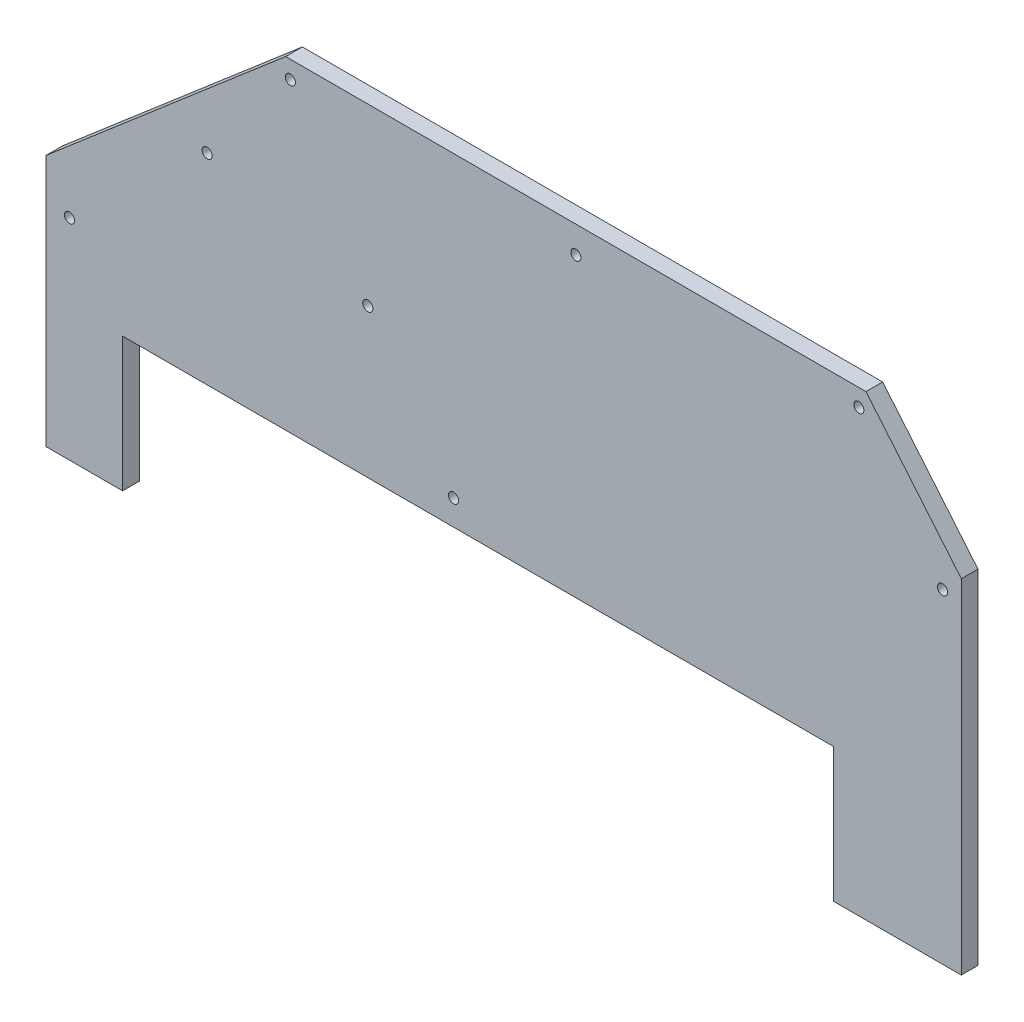
ISO-10303-21;
HEADER;
FILE_DESCRIPTION(('STEP AP214'),'2;1');
FILE_NAME('part.step','',(''),(''),'','','');
FILE_SCHEMA(('AUTOMOTIVE_DESIGN { 1 0 10303 214 1 1 1 1 }'));
ENDSEC;
DATA;
#1=APPLICATION_CONTEXT('core data for automotive mechanical design processes');
#2=APPLICATION_PROTOCOL_DEFINITION('international standard','automotive_design',2000,#1);
#3=PRODUCT_CONTEXT('',#1,'mechanical');
#4=PRODUCT('Part','Part','',(#3));
#5=PRODUCT_RELATED_PRODUCT_CATEGORY('part','',(#4));
#6=PRODUCT_DEFINITION_FORMATION('','',#4);
#7=PRODUCT_DEFINITION_CONTEXT('part definition',#1,'design');
#8=PRODUCT_DEFINITION('design','',#6,#7);
#9=PRODUCT_DEFINITION_SHAPE('','',#8);
#10=(LENGTH_UNIT() NAMED_UNIT(*) SI_UNIT(.MILLI.,.METRE.));
#11=(NAMED_UNIT(*) PLANE_ANGLE_UNIT() SI_UNIT($,.RADIAN.));
#12=(NAMED_UNIT(*) SI_UNIT($,.STERADIAN.) SOLID_ANGLE_UNIT());
#13=UNCERTAINTY_MEASURE_WITH_UNIT(LENGTH_MEASURE(1.E-05),#10,'distance_accuracy_value','');
#14=(GEOMETRIC_REPRESENTATION_CONTEXT(3) GLOBAL_UNCERTAINTY_ASSIGNED_CONTEXT((#13)) GLOBAL_UNIT_ASSIGNED_CONTEXT((#10,
#11,#12)) REPRESENTATION_CONTEXT('',''));
#15=CARTESIAN_POINT('',(0.,0.,0.));
#16=DIRECTION('',(0.,0.,1.));
#17=DIRECTION('',(1.,0.,0.));
#18=AXIS2_PLACEMENT_3D('',#15,#16,#17);
#19=CARTESIAN_POINT('',(0.,0.,11.1125));
#20=DIRECTION('',(0.,0.,1.));
#21=DIRECTION('',(1.,0.,0.));
#22=AXIS2_PLACEMENT_3D('',#19,#20,#21);
#23=PLANE('',#22);
#24=DIRECTION('',(0.,1.,0.));
#25=VECTOR('',#24,1.);
#26=CARTESIAN_POINT('',(-609.6,-12.5000000000001,11.1125));
#27=LINE('',#26,#25);
#28=CARTESIAN_POINT('',(-609.6,-12.5000000000001,11.1125));
#29=VERTEX_POINT('',#28);
#30=CARTESIAN_POINT('',(-609.6,155.482857142857,11.1125));
#31=VERTEX_POINT('',#30);
#32=EDGE_CURVE('E61',#29,#31,#27,.T.);
#33=ORIENTED_EDGE('',*,*,#32,.F.);
#34=DIRECTION('',(1.,0.,0.));
#35=VECTOR('',#34,1.);
#36=CARTESIAN_POINT('',(-627.78,-12.4999999999999,11.1125));
#37=LINE('',#36,#35);
#38=CARTESIAN_POINT('',(-558.565000000001,-12.5,11.1125));
#39=VERTEX_POINT('',#38);
#40=EDGE_CURVE('E110',#29,#39,#37,.T.);
#41=ORIENTED_EDGE('',*,*,#40,.T.);
#42=DIRECTION('',(0.,1.,0.));
#43=VECTOR('',#42,1.);
#44=CARTESIAN_POINT('',(-558.565000000001,-12.5,11.1125));
#45=LINE('',#44,#43);
#46=CARTESIAN_POINT('',(-558.565000000001,76.7619999999921,11.1125));
#47=VERTEX_POINT('',#46);
#48=EDGE_CURVE('E248',#39,#47,#45,.T.);
#49=ORIENTED_EDGE('',*,*,#48,.T.);
#50=DIRECTION('',(1.,0.,0.));
#51=VECTOR('',#50,1.);
#52=CARTESIAN_POINT('',(-558.565000000001,76.7619999999921,11.1125));
#53=LINE('',#52,#51);
#54=CARTESIAN_POINT('',(-84.9737000039998,76.761999999992,11.1125));
#55=VERTEX_POINT('',#54);
#56=EDGE_CURVE('E251',#47,#55,#53,.T.);
#57=ORIENTED_EDGE('',*,*,#56,.T.);
#58=DIRECTION('',(0.,-1.,0.));
#59=VECTOR('',#58,1.);
#60=CARTESIAN_POINT('',(-84.9737000039998,-12.5,11.1125));
#61=LINE('',#60,#59);
#62=CARTESIAN_POINT('',(-84.9737000039998,-12.5,11.1125));
#63=VERTEX_POINT('',#62);
#64=EDGE_CURVE('E254',#55,#63,#61,.T.);
#65=ORIENTED_EDGE('',*,*,#64,.T.);
#66=DIRECTION('',(1.,0.,0.));
#67=VECTOR('',#66,1.);
#68=CARTESIAN_POINT('',(0.,-12.5,11.1125));
#69=LINE('',#68,#67);
#70=CARTESIAN_POINT('',(0.,-12.5,11.1125));
#71=VERTEX_POINT('',#70);
#72=EDGE_CURVE('E134',#63,#71,#69,.T.);
#73=ORIENTED_EDGE('',*,*,#72,.T.);
#74=DIRECTION('',(0.,1.,0.));
#75=VECTOR('',#74,1.);
#76=CARTESIAN_POINT('',(0.,-12.5,11.1125));
#77=LINE('',#76,#75);
#78=CARTESIAN_POINT('',(2.27248775352962E-13,216.1,11.1125));
#79=VERTEX_POINT('',#78);
#80=EDGE_CURVE('E127',#71,#79,#77,.T.);
#81=ORIENTED_EDGE('',*,*,#80,.T.);
#82=DIRECTION('',(-0.640184399664484,0.768221279597372,0.));
#83=VECTOR('',#82,1.);
#84=CARTESIAN_POINT('',(2.27248775352962E-13,216.1,11.1125));
#85=LINE('',#84,#83);
#86=CARTESIAN_POINT('',(-63.4999999999995,292.299999999999,11.1125));
#87=VERTEX_POINT('',#86);
#88=EDGE_CURVE('E131',#79,#87,#85,.T.);
#89=ORIENTED_EDGE('',*,*,#88,.T.);
#90=DIRECTION('',(-1.,0.,0.));
#91=VECTOR('',#90,1.);
#92=CARTESIAN_POINT('',(-63.4999999999995,292.299999999999,11.1125));
#93=LINE('',#92,#91);
#94=CARTESIAN_POINT('',(-449.98,292.3,11.1125));
#95=VERTEX_POINT('',#94);
#96=EDGE_CURVE('E70',#87,#95,#93,.T.);
#97=ORIENTED_EDGE('',*,*,#96,.T.);
#98=DIRECTION('',(-0.759256602365297,-0.650791373455969,0.));
#99=VECTOR('',#98,1.);
#100=CARTESIAN_POINT('',(-449.98,292.3,11.1125));
#101=LINE('',#100,#99);
#102=EDGE_CURVE('E155',#95,#31,#101,.T.);
#103=ORIENTED_EDGE('',*,*,#102,.T.);
#104=EDGE_LOOP('',(#33,#41,#49,#57,#65,#73,#81,#89,#97,#103));
#105=FACE_BOUND('',#104,.T.);
#106=CARTESIAN_POINT('',(-502.262125610698,210.539469688394,11.1125));
#107=DIRECTION('',(0.,0.,1.));
#108=DIRECTION('',(1.,0.,0.));
#109=AXIS2_PLACEMENT_3D('',#106,#107,#108);
#110=CIRCLE('',#109,3.37819999999999);
#111=CARTESIAN_POINT('',(-498.883925610698,210.539469688394,11.1125));
#112=VERTEX_POINT('',#111);
#113=EDGE_CURVE('E320',#112,#112,#110,.T.);
#114=ORIENTED_EDGE('',*,*,#113,.F.);
#115=EDGE_LOOP('',(#114));
#116=FACE_BOUND('',#115,.T.);
#117=CARTESIAN_POINT('',(-338.209654284305,93.617887803001,11.1125));
#118=DIRECTION('',(0.,0.,1.));
#119=DIRECTION('',(1.,0.,0.));
#120=AXIS2_PLACEMENT_3D('',#117,#118,#119);
#121=CIRCLE('',#120,3.3782);
#122=CARTESIAN_POINT('',(-334.831454284305,93.617887803001,11.1125));
#123=VERTEX_POINT('',#122);
#124=EDGE_CURVE('E317',#123,#123,#121,.T.);
#125=ORIENTED_EDGE('',*,*,#124,.F.);
#126=EDGE_LOOP('',(#125));
#127=FACE_BOUND('',#126,.T.);
#128=CARTESIAN_POINT('',(-395.296950894929,175.84751254779,11.1125));
#129=DIRECTION('',(0.,0.,1.));
#130=DIRECTION('',(1.,0.,0.));
#131=AXIS2_PLACEMENT_3D('',#128,#129,#130);
#132=CIRCLE('',#131,3.37819999999999);
#133=CARTESIAN_POINT('',(-391.918750894929,175.84751254779,11.1125));
#134=VERTEX_POINT('',#133);
#135=EDGE_CURVE('E310',#134,#134,#132,.T.);
#136=ORIENTED_EDGE('',*,*,#135,.F.);
#137=EDGE_LOOP('',(#136));
#138=FACE_BOUND('',#137,.T.);
#139=CARTESIAN_POINT('',(-68.2333398844517,280.820108298407,11.1125));
#140=DIRECTION('',(0.,0.,-1.));
#141=DIRECTION('',(-1.,0.,0.));
#142=AXIS2_PLACEMENT_3D('',#139,#140,#141);
#143=CIRCLE('',#142,3.3655);
#144=CARTESIAN_POINT('',(-71.5988398844517,280.820108298407,11.1125));
#145=VERTEX_POINT('',#144);
#146=EDGE_CURVE('E233',#145,#145,#143,.T.);
#147=ORIENTED_EDGE('',*,*,#146,.T.);
#148=EDGE_LOOP('',(#147));
#149=FACE_BOUND('',#148,.T.);
#150=CARTESIAN_POINT('',(-256.739999999999,274.519999999999,11.1125));
#151=DIRECTION('',(0.,0.,-1.));
#152=DIRECTION('',(-1.,0.,0.));
#153=AXIS2_PLACEMENT_3D('',#150,#151,#152);
#154=CIRCLE('',#153,3.36550000000002);
#155=CARTESIAN_POINT('',(-260.105499999999,274.519999999999,11.1125));
#156=VERTEX_POINT('',#155);
#157=EDGE_CURVE('E220',#156,#156,#154,.T.);
#158=ORIENTED_EDGE('',*,*,#157,.T.);
#159=EDGE_LOOP('',(#158));
#160=FACE_BOUND('',#159,.T.);
#161=CARTESIAN_POINT('',(-446.846254522585,280.517309604129,11.1125));
#162=DIRECTION('',(0.,0.,-1.));
#163=DIRECTION('',(-1.,0.,0.));
#164=AXIS2_PLACEMENT_3D('',#161,#162,#163);
#165=CIRCLE('',#164,3.36549999999997);
#166=CARTESIAN_POINT('',(-450.211754522585,280.517309604129,11.1125));
#167=VERTEX_POINT('',#166);
#168=EDGE_CURVE('E216',#167,#167,#165,.T.);
#169=ORIENTED_EDGE('',*,*,#168,.T.);
#170=EDGE_LOOP('',(#169));
#171=FACE_BOUND('',#170,.T.);
#172=CARTESIAN_POINT('',(-593.953382299921,127.327,11.1125));
#173=DIRECTION('',(0.,0.,-1.));
#174=DIRECTION('',(-1.,0.,0.));
#175=AXIS2_PLACEMENT_3D('',#172,#173,#174);
#176=CIRCLE('',#175,3.36550000000002);
#177=CARTESIAN_POINT('',(-597.318882299921,127.327,11.1125));
#178=VERTEX_POINT('',#177);
#179=EDGE_CURVE('E212',#178,#178,#176,.T.);
#180=ORIENTED_EDGE('',*,*,#179,.T.);
#181=EDGE_LOOP('',(#180));
#182=FACE_BOUND('',#181,.T.);
#183=CARTESIAN_POINT('',(-12.4999999999996,203.6,11.1125));
#184=DIRECTION('',(0.,0.,1.));
#185=DIRECTION('',(1.,0.,0.));
#186=AXIS2_PLACEMENT_3D('',#183,#184,#185);
#187=CIRCLE('',#186,3.37820000000007);
#188=CARTESIAN_POINT('',(-9.12179999999955,203.6,11.1125));
#189=VERTEX_POINT('',#188);
#190=EDGE_CURVE('E166',#189,#189,#187,.T.);
#191=ORIENTED_EDGE('',*,*,#190,.F.);
#192=EDGE_LOOP('',(#191));
#193=FACE_BOUND('',#192,.T.);
#194=ADVANCED_FACE('F43',(#105,#116,#127,#138,#149,#160,#171,#182,#193),#23,.T.);
#195=CARTESIAN_POINT('',(0.,0.,0.));
#196=DIRECTION('',(0.,0.,1.));
#197=DIRECTION('',(1.,0.,0.));
#198=AXIS2_PLACEMENT_3D('',#195,#196,#197);
#199=PLANE('',#198);
#200=CARTESIAN_POINT('',(-502.262125610698,210.539469688394,0.));
#201=DIRECTION('',(0.,0.,1.));
#202=DIRECTION('',(1.,0.,0.));
#203=AXIS2_PLACEMENT_3D('',#200,#201,#202);
#204=CIRCLE('',#203,3.37819999999999);
#205=CARTESIAN_POINT('',(-498.883925610698,210.539469688394,0.));
#206=VERTEX_POINT('',#205);
#207=EDGE_CURVE('E306',#206,#206,#204,.T.);
#208=ORIENTED_EDGE('',*,*,#207,.T.);
#209=EDGE_LOOP('',(#208));
#210=FACE_BOUND('',#209,.T.);
#211=CARTESIAN_POINT('',(-338.209654284305,93.617887803001,0.));
#212=DIRECTION('',(0.,0.,1.));
#213=DIRECTION('',(1.,0.,0.));
#214=AXIS2_PLACEMENT_3D('',#211,#212,#213);
#215=CIRCLE('',#214,3.3782);
#216=CARTESIAN_POINT('',(-334.831454284305,93.617887803001,0.));
#217=VERTEX_POINT('',#216);
#218=EDGE_CURVE('E301',#217,#217,#215,.T.);
#219=ORIENTED_EDGE('',*,*,#218,.T.);
#220=EDGE_LOOP('',(#219));
#221=FACE_BOUND('',#220,.T.);
#222=CARTESIAN_POINT('',(-395.296950894929,175.84751254779,0.));
#223=DIRECTION('',(0.,0.,1.));
#224=DIRECTION('',(1.,0.,0.));
#225=AXIS2_PLACEMENT_3D('',#222,#223,#224);
#226=CIRCLE('',#225,3.37819999999999);
#227=CARTESIAN_POINT('',(-391.918750894929,175.84751254779,0.));
#228=VERTEX_POINT('',#227);
#229=EDGE_CURVE('E296',#228,#228,#226,.T.);
#230=ORIENTED_EDGE('',*,*,#229,.T.);
#231=EDGE_LOOP('',(#230));
#232=FACE_BOUND('',#231,.T.);
#233=CARTESIAN_POINT('',(-68.2333398844517,280.820108298407,0.));
#234=DIRECTION('',(0.,0.,1.));
#235=DIRECTION('',(1.,0.,0.));
#236=AXIS2_PLACEMENT_3D('',#233,#234,#235);
#237=CIRCLE('',#236,3.3655);
#238=CARTESIAN_POINT('',(-64.8678398844517,280.820108298407,0.));
#239=VERTEX_POINT('',#238);
#240=EDGE_CURVE('E47',#239,#239,#237,.T.);
#241=ORIENTED_EDGE('',*,*,#240,.T.);
#242=EDGE_LOOP('',(#241));
#243=FACE_BOUND('',#242,.T.);
#244=CARTESIAN_POINT('',(-256.739999999999,274.519999999999,0.));
#245=DIRECTION('',(0.,0.,1.));
#246=DIRECTION('',(1.,0.,0.));
#247=AXIS2_PLACEMENT_3D('',#244,#245,#246);
#248=CIRCLE('',#247,3.36550000000002);
#249=CARTESIAN_POINT('',(-253.374499999999,274.519999999999,0.));
#250=VERTEX_POINT('',#249);
#251=EDGE_CURVE('E217',#250,#250,#248,.T.);
#252=ORIENTED_EDGE('',*,*,#251,.T.);
#253=EDGE_LOOP('',(#252));
#254=FACE_BOUND('',#253,.T.);
#255=CARTESIAN_POINT('',(-446.846254522585,280.517309604129,0.));
#256=DIRECTION('',(0.,0.,1.));
#257=DIRECTION('',(1.,0.,0.));
#258=AXIS2_PLACEMENT_3D('',#255,#256,#257);
#259=CIRCLE('',#258,3.36549999999997);
#260=CARTESIAN_POINT('',(-443.480754522585,280.517309604129,0.));
#261=VERTEX_POINT('',#260);
#262=EDGE_CURVE('E213',#261,#261,#259,.T.);
#263=ORIENTED_EDGE('',*,*,#262,.T.);
#264=EDGE_LOOP('',(#263));
#265=FACE_BOUND('',#264,.T.);
#266=CARTESIAN_POINT('',(-593.953382299921,127.327,0.));
#267=DIRECTION('',(0.,0.,1.));
#268=DIRECTION('',(1.,0.,0.));
#269=AXIS2_PLACEMENT_3D('',#266,#267,#268);
#270=CIRCLE('',#269,3.36550000000002);
#271=CARTESIAN_POINT('',(-590.587882299921,127.327,0.));
#272=VERTEX_POINT('',#271);
#273=EDGE_CURVE('E207',#272,#272,#270,.T.);
#274=ORIENTED_EDGE('',*,*,#273,.T.);
#275=EDGE_LOOP('',(#274));
#276=FACE_BOUND('',#275,.T.);
#277=DIRECTION('',(1.,0.,0.));
#278=VECTOR('',#277,1.);
#279=CARTESIAN_POINT('',(-627.78,-12.4999999999999,0.));
#280=LINE('',#279,#278);
#281=CARTESIAN_POINT('',(-609.6,-12.5000000000001,0.));
#282=VERTEX_POINT('',#281);
#283=CARTESIAN_POINT('',(-558.565000000001,-12.5,0.));
#284=VERTEX_POINT('',#283);
#285=EDGE_CURVE('E162',#282,#284,#280,.T.);
#286=ORIENTED_EDGE('',*,*,#285,.F.);
#287=DIRECTION('',(0.,1.,0.));
#288=VECTOR('',#287,1.);
#289=CARTESIAN_POINT('',(-609.6,-12.5000000000001,0.));
#290=LINE('',#289,#288);
#291=CARTESIAN_POINT('',(-609.6,155.482857142857,0.));
#292=VERTEX_POINT('',#291);
#293=EDGE_CURVE('E279',#282,#292,#290,.T.);
#294=ORIENTED_EDGE('',*,*,#293,.T.);
#295=DIRECTION('',(-0.759256602365297,-0.650791373455969,0.));
#296=VECTOR('',#295,1.);
#297=CARTESIAN_POINT('',(-449.98,292.3,0.));
#298=LINE('',#297,#296);
#299=CARTESIAN_POINT('',(-449.98,292.3,0.));
#300=VERTEX_POINT('',#299);
#301=EDGE_CURVE('E186',#300,#292,#298,.T.);
#302=ORIENTED_EDGE('',*,*,#301,.F.);
#303=DIRECTION('',(-1.,0.,0.));
#304=VECTOR('',#303,1.);
#305=CARTESIAN_POINT('',(-63.4999999999995,292.299999999999,0.));
#306=LINE('',#305,#304);
#307=CARTESIAN_POINT('',(-63.4999999999995,292.299999999999,0.));
#308=VERTEX_POINT('',#307);
#309=EDGE_CURVE('E103',#308,#300,#306,.T.);
#310=ORIENTED_EDGE('',*,*,#309,.F.);
#311=DIRECTION('',(-0.640184399664484,0.768221279597372,0.));
#312=VECTOR('',#311,1.);
#313=CARTESIAN_POINT('',(2.27248775352962E-13,216.1,0.));
#314=LINE('',#313,#312);
#315=CARTESIAN_POINT('',(2.27248775352962E-13,216.1,0.));
#316=VERTEX_POINT('',#315);
#317=EDGE_CURVE('E181',#316,#308,#314,.T.);
#318=ORIENTED_EDGE('',*,*,#317,.F.);
#319=DIRECTION('',(0.,1.,0.));
#320=VECTOR('',#319,1.);
#321=CARTESIAN_POINT('',(0.,-12.5,0.));
#322=LINE('',#321,#320);
#323=CARTESIAN_POINT('',(0.,-12.5,0.));
#324=VERTEX_POINT('',#323);
#325=EDGE_CURVE('E144',#324,#316,#322,.T.);
#326=ORIENTED_EDGE('',*,*,#325,.F.);
#327=DIRECTION('',(1.,0.,0.));
#328=VECTOR('',#327,1.);
#329=CARTESIAN_POINT('',(0.,-12.5,0.));
#330=LINE('',#329,#328);
#331=CARTESIAN_POINT('',(-84.9737000039998,-12.5,0.));
#332=VERTEX_POINT('',#331);
#333=EDGE_CURVE('E176',#332,#324,#330,.T.);
#334=ORIENTED_EDGE('',*,*,#333,.F.);
#335=DIRECTION('',(0.,-1.,0.));
#336=VECTOR('',#335,1.);
#337=CARTESIAN_POINT('',(-84.9737000039998,-12.5,0.));
#338=LINE('',#337,#336);
#339=CARTESIAN_POINT('',(-84.9737000039998,76.761999999992,0.));
#340=VERTEX_POINT('',#339);
#341=EDGE_CURVE('E173',#340,#332,#338,.T.);
#342=ORIENTED_EDGE('',*,*,#341,.F.);
#343=DIRECTION('',(1.,0.,0.));
#344=VECTOR('',#343,1.);
#345=CARTESIAN_POINT('',(-140.853700004,76.761999999992,0.));
#346=LINE('',#345,#344);
#347=CARTESIAN_POINT('',(-558.565000000001,76.7619999999921,0.));
#348=VERTEX_POINT('',#347);
#349=EDGE_CURVE('E170',#348,#340,#346,.T.);
#350=ORIENTED_EDGE('',*,*,#349,.F.);
#351=DIRECTION('',(0.,1.,0.));
#352=VECTOR('',#351,1.);
#353=CARTESIAN_POINT('',(-558.565000000001,-12.5,0.));
#354=LINE('',#353,#352);
#355=EDGE_CURVE('E165',#284,#348,#354,.T.);
#356=ORIENTED_EDGE('',*,*,#355,.F.);
#357=EDGE_LOOP('',(#286,#294,#302,#310,#318,#326,#334,#342,#350,#356));
#358=FACE_BOUND('',#357,.T.);
#359=CARTESIAN_POINT('',(-12.4999999999996,203.6,0.));
#360=DIRECTION('',(0.,0.,1.));
#361=DIRECTION('',(1.,0.,0.));
#362=AXIS2_PLACEMENT_3D('',#359,#360,#361);
#363=CIRCLE('',#362,3.37820000000007);
#364=CARTESIAN_POINT('',(-9.12179999999955,203.6,0.));
#365=VERTEX_POINT('',#364);
#366=EDGE_CURVE('E211',#365,#365,#363,.T.);
#367=ORIENTED_EDGE('',*,*,#366,.T.);
#368=EDGE_LOOP('',(#367));
#369=FACE_BOUND('',#368,.T.);
#370=ADVANCED_FACE('F269',(#210,#221,#232,#243,#254,#265,#276,#358,#369),#199,.F.);
#371=CARTESIAN_POINT('',(-627.78,-12.4999999999999,11.1125));
#372=DIRECTION('',(0.,1.,0.));
#373=DIRECTION('',(-1.,0.,0.));
#374=AXIS2_PLACEMENT_3D('',#371,#372,#373);
#375=PLANE('',#374);
#376=ORIENTED_EDGE('',*,*,#40,.F.);
#377=DIRECTION('',(0.,0.,1.));
#378=VECTOR('',#377,1.);
#379=CARTESIAN_POINT('',(-609.6,-12.5000000000001,0.));
#380=LINE('',#379,#378);
#381=EDGE_CURVE('E283',#282,#29,#380,.T.);
#382=ORIENTED_EDGE('',*,*,#381,.F.);
#383=ORIENTED_EDGE('',*,*,#285,.T.);
#384=DIRECTION('',(0.,0.,-1.));
#385=VECTOR('',#384,1.);
#386=CARTESIAN_POINT('',(-558.565000000001,-12.5,11.1125));
#387=LINE('',#386,#385);
#388=EDGE_CURVE('E11',#39,#284,#387,.T.);
#389=ORIENTED_EDGE('',*,*,#388,.F.);
#390=EDGE_LOOP('',(#376,#382,#383,#389));
#391=FACE_BOUND('',#390,.T.);
#392=ADVANCED_FACE('F45',(#391),#375,.F.);
#393=CARTESIAN_POINT('',(-558.565000000001,-12.5,11.1125));
#394=DIRECTION('',(-1.,0.,0.));
#395=DIRECTION('',(0.,0.,1.));
#396=AXIS2_PLACEMENT_3D('',#393,#394,#395);
#397=PLANE('',#396);
#398=ORIENTED_EDGE('',*,*,#355,.T.);
#399=DIRECTION('',(0.,0.,-1.));
#400=VECTOR('',#399,1.);
#401=CARTESIAN_POINT('',(-558.565000000001,76.7619999999921,11.1125));
#402=LINE('',#401,#400);
#403=EDGE_CURVE('E53',#47,#348,#402,.T.);
#404=ORIENTED_EDGE('',*,*,#403,.F.);
#405=ORIENTED_EDGE('',*,*,#48,.F.);
#406=ORIENTED_EDGE('',*,*,#388,.T.);
#407=EDGE_LOOP('',(#398,#404,#405,#406));
#408=FACE_BOUND('',#407,.T.);
#409=ADVANCED_FACE('F288',(#408),#397,.F.);
#410=CARTESIAN_POINT('',(-140.853700004,76.761999999992,11.1125));
#411=DIRECTION('',(0.,1.,0.));
#412=DIRECTION('',(0.,0.,1.));
#413=AXIS2_PLACEMENT_3D('',#410,#411,#412);
#414=PLANE('',#413);
#415=ORIENTED_EDGE('',*,*,#349,.T.);
#416=DIRECTION('',(0.,0.,-1.));
#417=VECTOR('',#416,1.);
#418=CARTESIAN_POINT('',(-84.9737000039998,76.761999999992,11.1125));
#419=LINE('',#418,#417);
#420=EDGE_CURVE('E200',#55,#340,#419,.T.);
#421=ORIENTED_EDGE('',*,*,#420,.F.);
#422=ORIENTED_EDGE('',*,*,#56,.F.);
#423=ORIENTED_EDGE('',*,*,#403,.T.);
#424=EDGE_LOOP('',(#415,#421,#422,#423));
#425=FACE_BOUND('',#424,.T.);
#426=ADVANCED_FACE('F290',(#425),#414,.F.);
#427=CARTESIAN_POINT('',(-84.9737000039998,-12.5,11.1125));
#428=DIRECTION('',(1.,0.,0.));
#429=DIRECTION('',(0.,0.,-1.));
#430=AXIS2_PLACEMENT_3D('',#427,#428,#429);
#431=PLANE('',#430);
#432=ORIENTED_EDGE('',*,*,#341,.T.);
#433=DIRECTION('',(0.,0.,-1.));
#434=VECTOR('',#433,1.);
#435=CARTESIAN_POINT('',(-84.9737000039998,-12.5,11.1125));
#436=LINE('',#435,#434);
#437=EDGE_CURVE('E196',#63,#332,#436,.T.);
#438=ORIENTED_EDGE('',*,*,#437,.F.);
#439=ORIENTED_EDGE('',*,*,#64,.F.);
#440=ORIENTED_EDGE('',*,*,#420,.T.);
#441=EDGE_LOOP('',(#432,#438,#439,#440));
#442=FACE_BOUND('',#441,.T.);
#443=ADVANCED_FACE('F262',(#442),#431,.F.);
#444=CARTESIAN_POINT('',(0.,-12.5,11.1125));
#445=DIRECTION('',(0.,1.,0.));
#446=DIRECTION('',(-1.,0.,0.));
#447=AXIS2_PLACEMENT_3D('',#444,#445,#446);
#448=PLANE('',#447);
#449=ORIENTED_EDGE('',*,*,#333,.T.);
#450=DIRECTION('',(0.,0.,-1.));
#451=VECTOR('',#450,1.);
#452=CARTESIAN_POINT('',(0.,-12.5,11.1125));
#453=LINE('',#452,#451);
#454=EDGE_CURVE('E148',#71,#324,#453,.T.);
#455=ORIENTED_EDGE('',*,*,#454,.F.);
#456=ORIENTED_EDGE('',*,*,#72,.F.);
#457=ORIENTED_EDGE('',*,*,#437,.T.);
#458=EDGE_LOOP('',(#449,#455,#456,#457));
#459=FACE_BOUND('',#458,.T.);
#460=ADVANCED_FACE('F266',(#459),#448,.F.);
#461=CARTESIAN_POINT('',(0.,-12.5,11.1125));
#462=DIRECTION('',(-1.,0.,0.));
#463=DIRECTION('',(0.,-1.,0.));
#464=AXIS2_PLACEMENT_3D('',#461,#462,#463);
#465=PLANE('',#464);
#466=ORIENTED_EDGE('',*,*,#325,.T.);
#467=DIRECTION('',(0.,0.,-1.));
#468=VECTOR('',#467,1.);
#469=CARTESIAN_POINT('',(2.27248775352962E-13,216.1,11.1125));
#470=LINE('',#469,#468);
#471=EDGE_CURVE('E141',#79,#316,#470,.T.);
#472=ORIENTED_EDGE('',*,*,#471,.F.);
#473=ORIENTED_EDGE('',*,*,#80,.F.);
#474=ORIENTED_EDGE('',*,*,#454,.T.);
#475=EDGE_LOOP('',(#466,#472,#473,#474));
#476=FACE_BOUND('',#475,.T.);
#477=ADVANCED_FACE('F142',(#476),#465,.F.);
#478=CARTESIAN_POINT('',(2.27248775352962E-13,216.1,11.1125));
#479=DIRECTION('',(-0.768221279597372,-0.640184399664484,0.));
#480=DIRECTION('',(0.640184399664484,-0.768221279597372,0.));
#481=AXIS2_PLACEMENT_3D('',#478,#479,#480);
#482=PLANE('',#481);
#483=ORIENTED_EDGE('',*,*,#317,.T.);
#484=DIRECTION('',(0.,0.,-1.));
#485=VECTOR('',#484,1.);
#486=CARTESIAN_POINT('',(-63.4999999999995,292.299999999999,11.1125));
#487=LINE('',#486,#485);
#488=EDGE_CURVE('E149',#87,#308,#487,.T.);
#489=ORIENTED_EDGE('',*,*,#488,.F.);
#490=ORIENTED_EDGE('',*,*,#88,.F.);
#491=ORIENTED_EDGE('',*,*,#471,.T.);
#492=EDGE_LOOP('',(#483,#489,#490,#491));
#493=FACE_BOUND('',#492,.T.);
#494=ADVANCED_FACE('F151',(#493),#482,.F.);
#495=CARTESIAN_POINT('',(-63.4999999999995,292.299999999999,11.1125));
#496=DIRECTION('',(0.,-1.,0.));
#497=DIRECTION('',(1.,0.,0.));
#498=AXIS2_PLACEMENT_3D('',#495,#496,#497);
#499=PLANE('',#498);
#500=ORIENTED_EDGE('',*,*,#309,.T.);
#501=DIRECTION('',(0.,0.,-1.));
#502=VECTOR('',#501,1.);
#503=CARTESIAN_POINT('',(-449.98,292.3,11.1125));
#504=LINE('',#503,#502);
#505=EDGE_CURVE('E161',#95,#300,#504,.T.);
#506=ORIENTED_EDGE('',*,*,#505,.F.);
#507=ORIENTED_EDGE('',*,*,#96,.F.);
#508=ORIENTED_EDGE('',*,*,#488,.T.);
#509=EDGE_LOOP('',(#500,#506,#507,#508));
#510=FACE_BOUND('',#509,.T.);
#511=ADVANCED_FACE('F272',(#510),#499,.F.);
#512=CARTESIAN_POINT('',(-449.98,292.3,11.1125));
#513=DIRECTION('',(0.650791373455968,-0.759256602365296,0.));
#514=DIRECTION('',(0.759256602365297,0.650791373455969,0.));
#515=AXIS2_PLACEMENT_3D('',#512,#513,#514);
#516=PLANE('',#515);
#517=ORIENTED_EDGE('',*,*,#301,.T.);
#518=DIRECTION('',(0.,0.,1.));
#519=VECTOR('',#518,1.);
#520=CARTESIAN_POINT('',(-609.6,155.482857142857,0.));
#521=LINE('',#520,#519);
#522=EDGE_CURVE('E276',#292,#31,#521,.T.);
#523=ORIENTED_EDGE('',*,*,#522,.T.);
#524=ORIENTED_EDGE('',*,*,#102,.F.);
#525=ORIENTED_EDGE('',*,*,#505,.T.);
#526=EDGE_LOOP('',(#517,#523,#524,#525));
#527=FACE_BOUND('',#526,.T.);
#528=ADVANCED_FACE('F275',(#527),#516,.F.);
#529=CARTESIAN_POINT('',(-12.4999999999996,203.6,11.1125));
#530=DIRECTION('',(0.,0.,-1.));
#531=DIRECTION('',(-1.,0.,0.));
#532=AXIS2_PLACEMENT_3D('',#529,#530,#531);
#533=CYLINDRICAL_SURFACE('',#532,3.37820000000007);
#534=ORIENTED_EDGE('',*,*,#190,.T.);
#535=EDGE_LOOP('',(#534));
#536=FACE_BOUND('',#535,.T.);
#537=ORIENTED_EDGE('',*,*,#366,.F.);
#538=EDGE_LOOP('',(#537));
#539=FACE_BOUND('',#538,.T.);
#540=ADVANCED_FACE('F349',(#536,#539),#533,.F.);
#541=CARTESIAN_POINT('',(-593.953382299921,127.327,11.1125));
#542=DIRECTION('',(0.,0.,-1.));
#543=DIRECTION('',(-1.,0.,0.));
#544=AXIS2_PLACEMENT_3D('',#541,#542,#543);
#545=CYLINDRICAL_SURFACE('',#544,3.36550000000002);
#546=ORIENTED_EDGE('',*,*,#179,.F.);
#547=EDGE_LOOP('',(#546));
#548=FACE_BOUND('',#547,.T.);
#549=ORIENTED_EDGE('',*,*,#273,.F.);
#550=EDGE_LOOP('',(#549));
#551=FACE_BOUND('',#550,.T.);
#552=ADVANCED_FACE('F346',(#548,#551),#545,.F.);
#553=CARTESIAN_POINT('',(-446.846254522585,280.517309604129,11.1125));
#554=DIRECTION('',(0.,0.,-1.));
#555=DIRECTION('',(-1.,0.,0.));
#556=AXIS2_PLACEMENT_3D('',#553,#554,#555);
#557=CYLINDRICAL_SURFACE('',#556,3.36549999999997);
#558=ORIENTED_EDGE('',*,*,#168,.F.);
#559=EDGE_LOOP('',(#558));
#560=FACE_BOUND('',#559,.T.);
#561=ORIENTED_EDGE('',*,*,#262,.F.);
#562=EDGE_LOOP('',(#561));
#563=FACE_BOUND('',#562,.T.);
#564=ADVANCED_FACE('F348',(#560,#563),#557,.F.);
#565=CARTESIAN_POINT('',(-256.739999999999,274.519999999999,11.1125));
#566=DIRECTION('',(0.,0.,-1.));
#567=DIRECTION('',(-1.,0.,0.));
#568=AXIS2_PLACEMENT_3D('',#565,#566,#567);
#569=CYLINDRICAL_SURFACE('',#568,3.36550000000002);
#570=ORIENTED_EDGE('',*,*,#157,.F.);
#571=EDGE_LOOP('',(#570));
#572=FACE_BOUND('',#571,.T.);
#573=ORIENTED_EDGE('',*,*,#251,.F.);
#574=EDGE_LOOP('',(#573));
#575=FACE_BOUND('',#574,.T.);
#576=ADVANCED_FACE('F334',(#572,#575),#569,.F.);
#577=CARTESIAN_POINT('',(-68.2333398844517,280.820108298407,11.1125));
#578=DIRECTION('',(0.,0.,-1.));
#579=DIRECTION('',(-1.,0.,0.));
#580=AXIS2_PLACEMENT_3D('',#577,#578,#579);
#581=CYLINDRICAL_SURFACE('',#580,3.3655);
#582=ORIENTED_EDGE('',*,*,#146,.F.);
#583=EDGE_LOOP('',(#582));
#584=FACE_BOUND('',#583,.T.);
#585=ORIENTED_EDGE('',*,*,#240,.F.);
#586=EDGE_LOOP('',(#585));
#587=FACE_BOUND('',#586,.T.);
#588=ADVANCED_FACE('F330',(#584,#587),#581,.F.);
#589=CARTESIAN_POINT('',(-395.296950894929,175.84751254779,0.));
#590=DIRECTION('',(0.,0.,1.));
#591=DIRECTION('',(1.,0.,0.));
#592=AXIS2_PLACEMENT_3D('',#589,#590,#591);
#593=CYLINDRICAL_SURFACE('',#592,3.37819999999999);
#594=ORIENTED_EDGE('',*,*,#135,.T.);
#595=EDGE_LOOP('',(#594));
#596=FACE_BOUND('',#595,.T.);
#597=ORIENTED_EDGE('',*,*,#229,.F.);
#598=EDGE_LOOP('',(#597));
#599=FACE_BOUND('',#598,.T.);
#600=ADVANCED_FACE('F333',(#596,#599),#593,.F.);
#601=CARTESIAN_POINT('',(-338.209654284305,93.617887803001,0.));
#602=DIRECTION('',(0.,0.,1.));
#603=DIRECTION('',(1.,0.,0.));
#604=AXIS2_PLACEMENT_3D('',#601,#602,#603);
#605=CYLINDRICAL_SURFACE('',#604,3.3782);
#606=ORIENTED_EDGE('',*,*,#124,.T.);
#607=EDGE_LOOP('',(#606));
#608=FACE_BOUND('',#607,.T.);
#609=ORIENTED_EDGE('',*,*,#218,.F.);
#610=EDGE_LOOP('',(#609));
#611=FACE_BOUND('',#610,.T.);
#612=ADVANCED_FACE('F406',(#608,#611),#605,.F.);
#613=CARTESIAN_POINT('',(-502.262125610698,210.539469688394,0.));
#614=DIRECTION('',(0.,0.,1.));
#615=DIRECTION('',(1.,0.,0.));
#616=AXIS2_PLACEMENT_3D('',#613,#614,#615);
#617=CYLINDRICAL_SURFACE('',#616,3.37819999999999);
#618=ORIENTED_EDGE('',*,*,#113,.T.);
#619=EDGE_LOOP('',(#618));
#620=FACE_BOUND('',#619,.T.);
#621=ORIENTED_EDGE('',*,*,#207,.F.);
#622=EDGE_LOOP('',(#621));
#623=FACE_BOUND('',#622,.T.);
#624=ADVANCED_FACE('F401',(#620,#623),#617,.F.);
#625=CARTESIAN_POINT('',(-609.6,-12.5000000000001,0.));
#626=DIRECTION('',(1.,0.,0.));
#627=DIRECTION('',(0.,0.,-1.));
#628=AXIS2_PLACEMENT_3D('',#625,#626,#627);
#629=PLANE('',#628);
#630=ORIENTED_EDGE('',*,*,#32,.T.);
#631=ORIENTED_EDGE('',*,*,#522,.F.);
#632=ORIENTED_EDGE('',*,*,#293,.F.);
#633=ORIENTED_EDGE('',*,*,#381,.T.);
#634=EDGE_LOOP('',(#630,#631,#632,#633));
#635=FACE_BOUND('',#634,.T.);
#636=ADVANCED_FACE('F294',(#635),#629,.F.);
#637=CLOSED_SHELL('',(#194,#370,#392,#409,#426,#443,#460,#477,#494,#511,#528,#540,#552,#564,
#576,#588,#600,#612,#624,#636));
#638=MANIFOLD_SOLID_BREP('B2',#637);
#639=ADVANCED_BREP_SHAPE_REPRESENTATION('',(#18,#638),#14);
#640=SHAPE_DEFINITION_REPRESENTATION(#9,#639);
ENDSEC;
END-ISO-10303-21;
